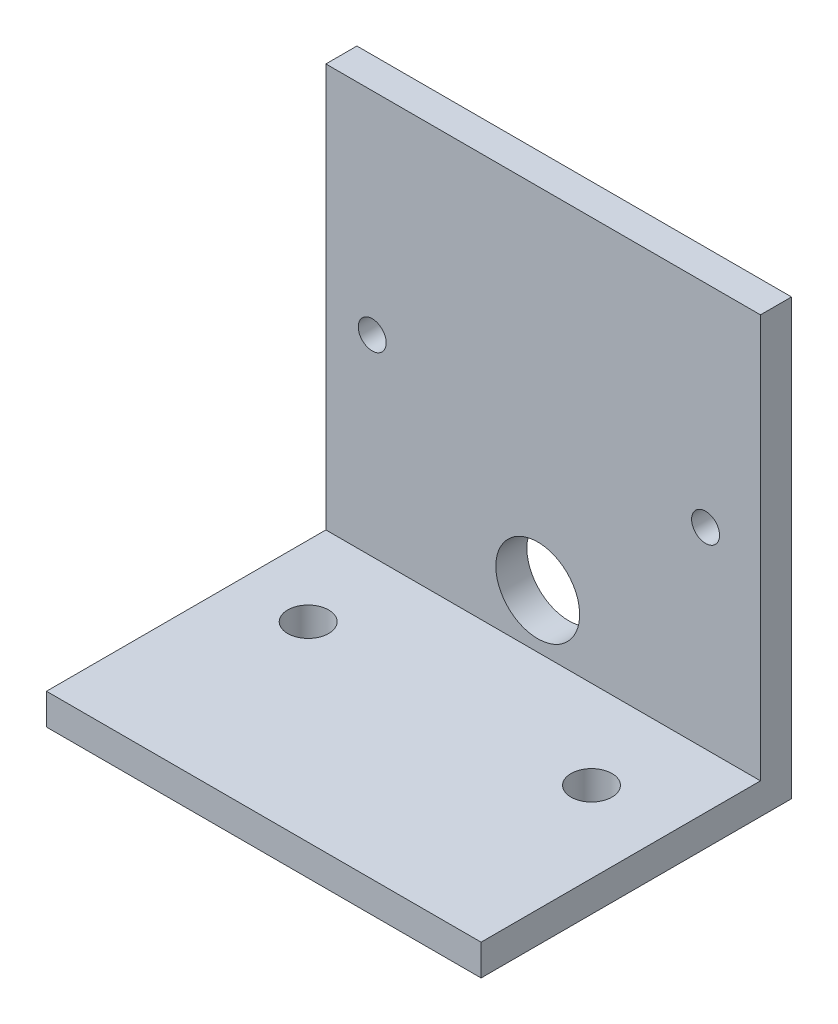
ISO-10303-21;
HEADER;
FILE_DESCRIPTION(('STEP AP214'),'2;1');
FILE_NAME('part.step','',(''),(''),'','','');
FILE_SCHEMA(('AUTOMOTIVE_DESIGN { 1 0 10303 214 1 1 1 1 }'));
ENDSEC;
DATA;
#1=APPLICATION_CONTEXT('core data for automotive mechanical design processes');
#2=APPLICATION_PROTOCOL_DEFINITION('international standard','automotive_design',2000,#1);
#3=PRODUCT_CONTEXT('',#1,'mechanical');
#4=PRODUCT('Part','Part','',(#3));
#5=PRODUCT_RELATED_PRODUCT_CATEGORY('part','',(#4));
#6=PRODUCT_DEFINITION_FORMATION('','',#4);
#7=PRODUCT_DEFINITION_CONTEXT('part definition',#1,'design');
#8=PRODUCT_DEFINITION('design','',#6,#7);
#9=PRODUCT_DEFINITION_SHAPE('','',#8);
#10=(LENGTH_UNIT() NAMED_UNIT(*) SI_UNIT(.MILLI.,.METRE.));
#11=(NAMED_UNIT(*) PLANE_ANGLE_UNIT() SI_UNIT($,.RADIAN.));
#12=(NAMED_UNIT(*) SI_UNIT($,.STERADIAN.) SOLID_ANGLE_UNIT());
#13=UNCERTAINTY_MEASURE_WITH_UNIT(LENGTH_MEASURE(1.E-05),#10,'distance_accuracy_value','');
#14=(GEOMETRIC_REPRESENTATION_CONTEXT(3) GLOBAL_UNCERTAINTY_ASSIGNED_CONTEXT((#13)) GLOBAL_UNIT_ASSIGNED_CONTEXT((#10,
#11,#12)) REPRESENTATION_CONTEXT('',''));
#15=CARTESIAN_POINT('',(0.,0.,0.));
#16=DIRECTION('',(0.,0.,1.));
#17=DIRECTION('',(1.,0.,0.));
#18=AXIS2_PLACEMENT_3D('',#15,#16,#17);
#19=CARTESIAN_POINT('',(35.,-35.,50.));
#20=DIRECTION('',(-1.,0.,0.));
#21=DIRECTION('',(0.,0.,1.));
#22=AXIS2_PLACEMENT_3D('',#19,#20,#21);
#23=PLANE('',#22);
#24=DIRECTION('',(0.,1.,0.));
#25=VECTOR('',#24,1.);
#26=CARTESIAN_POINT('',(35.,-30.,5.));
#27=LINE('',#26,#25);
#28=CARTESIAN_POINT('',(35.,-30.,5.));
#29=VERTEX_POINT('',#28);
#30=CARTESIAN_POINT('',(35.,35.,5.));
#31=VERTEX_POINT('',#30);
#32=EDGE_CURVE('E137',#29,#31,#27,.T.);
#33=ORIENTED_EDGE('',*,*,#32,.F.);
#34=DIRECTION('',(0.,0.,-1.));
#35=VECTOR('',#34,1.);
#36=CARTESIAN_POINT('',(35.,-30.,128.137615707359));
#37=LINE('',#36,#35);
#38=CARTESIAN_POINT('',(35.,-30.,50.));
#39=VERTEX_POINT('',#38);
#40=EDGE_CURVE('E134',#39,#29,#37,.T.);
#41=ORIENTED_EDGE('',*,*,#40,.F.);
#42=DIRECTION('',(0.,1.,0.));
#43=VECTOR('',#42,1.);
#44=CARTESIAN_POINT('',(35.,-35.,50.));
#45=LINE('',#44,#43);
#46=CARTESIAN_POINT('',(35.,-35.,50.));
#47=VERTEX_POINT('',#46);
#48=EDGE_CURVE('E86',#47,#39,#45,.T.);
#49=ORIENTED_EDGE('',*,*,#48,.F.);
#50=DIRECTION('',(0.,0.,-1.));
#51=VECTOR('',#50,1.);
#52=CARTESIAN_POINT('',(35.,-35.,50.));
#53=LINE('',#52,#51);
#54=CARTESIAN_POINT('',(35.,-35.,0.));
#55=VERTEX_POINT('',#54);
#56=EDGE_CURVE('E79',#47,#55,#53,.T.);
#57=ORIENTED_EDGE('',*,*,#56,.T.);
#58=DIRECTION('',(0.,1.,0.));
#59=VECTOR('',#58,1.);
#60=CARTESIAN_POINT('',(35.,-35.,0.));
#61=LINE('',#60,#59);
#62=CARTESIAN_POINT('',(35.,35.,0.));
#63=VERTEX_POINT('',#62);
#64=EDGE_CURVE('E93',#55,#63,#61,.T.);
#65=ORIENTED_EDGE('',*,*,#64,.T.);
#66=DIRECTION('',(0.,0.,-1.));
#67=VECTOR('',#66,1.);
#68=CARTESIAN_POINT('',(35.,35.,50.));
#69=LINE('',#68,#67);
#70=EDGE_CURVE('E112',#31,#63,#69,.T.);
#71=ORIENTED_EDGE('',*,*,#70,.F.);
#72=EDGE_LOOP('',(#33,#41,#49,#57,#65,#71));
#73=FACE_BOUND('',#72,.T.);
#74=ADVANCED_FACE('F32',(#73),#23,.F.);
#75=CARTESIAN_POINT('',(-35.,35.,50.));
#76=DIRECTION('',(0.,-1.,0.));
#77=DIRECTION('',(0.,0.,-1.));
#78=AXIS2_PLACEMENT_3D('',#75,#76,#77);
#79=PLANE('',#78);
#80=DIRECTION('',(0.,0.,-1.));
#81=VECTOR('',#80,1.);
#82=CARTESIAN_POINT('',(-35.,35.,50.));
#83=LINE('',#82,#81);
#84=CARTESIAN_POINT('',(-35.,35.,5.));
#85=VERTEX_POINT('',#84);
#86=CARTESIAN_POINT('',(-35.,35.,0.));
#87=VERTEX_POINT('',#86);
#88=EDGE_CURVE('E110',#85,#87,#83,.T.);
#89=ORIENTED_EDGE('',*,*,#88,.F.);
#90=DIRECTION('',(1.,0.,0.));
#91=VECTOR('',#90,1.);
#92=CARTESIAN_POINT('',(-35.,35.,5.));
#93=LINE('',#92,#91);
#94=EDGE_CURVE('E100',#85,#31,#93,.T.);
#95=ORIENTED_EDGE('',*,*,#94,.T.);
#96=ORIENTED_EDGE('',*,*,#70,.T.);
#97=DIRECTION('',(-1.,0.,0.));
#98=VECTOR('',#97,1.);
#99=CARTESIAN_POINT('',(-35.,35.,0.));
#100=LINE('',#99,#98);
#101=EDGE_CURVE('E99',#63,#87,#100,.T.);
#102=ORIENTED_EDGE('',*,*,#101,.T.);
#103=EDGE_LOOP('',(#89,#95,#96,#102));
#104=FACE_BOUND('',#103,.T.);
#105=ADVANCED_FACE('F152',(#104),#79,.F.);
#106=CARTESIAN_POINT('',(-35.,-35.,50.));
#107=DIRECTION('',(1.,0.,0.));
#108=DIRECTION('',(0.,0.,-1.));
#109=AXIS2_PLACEMENT_3D('',#106,#107,#108);
#110=PLANE('',#109);
#111=DIRECTION('',(0.,-1.,0.));
#112=VECTOR('',#111,1.);
#113=CARTESIAN_POINT('',(-35.,-35.,50.));
#114=LINE('',#113,#112);
#115=CARTESIAN_POINT('',(-35.,-30.,50.));
#116=VERTEX_POINT('',#115);
#117=CARTESIAN_POINT('',(-35.,-35.,50.));
#118=VERTEX_POINT('',#117);
#119=EDGE_CURVE('E144',#116,#118,#114,.T.);
#120=ORIENTED_EDGE('',*,*,#119,.F.);
#121=DIRECTION('',(0.,0.,-1.));
#122=VECTOR('',#121,1.);
#123=CARTESIAN_POINT('',(-35.,-30.,50.));
#124=LINE('',#123,#122);
#125=CARTESIAN_POINT('',(-35.,-30.,5.));
#126=VERTEX_POINT('',#125);
#127=EDGE_CURVE('E48',#116,#126,#124,.T.);
#128=ORIENTED_EDGE('',*,*,#127,.T.);
#129=DIRECTION('',(0.,1.,0.));
#130=VECTOR('',#129,1.);
#131=CARTESIAN_POINT('',(-35.,-35.,5.));
#132=LINE('',#131,#130);
#133=EDGE_CURVE('E11',#126,#85,#132,.T.);
#134=ORIENTED_EDGE('',*,*,#133,.T.);
#135=ORIENTED_EDGE('',*,*,#88,.T.);
#136=DIRECTION('',(0.,-1.,0.));
#137=VECTOR('',#136,1.);
#138=CARTESIAN_POINT('',(-35.,-35.,0.));
#139=LINE('',#138,#137);
#140=CARTESIAN_POINT('',(-35.,-35.,0.));
#141=VERTEX_POINT('',#140);
#142=EDGE_CURVE('E87',#87,#141,#139,.T.);
#143=ORIENTED_EDGE('',*,*,#142,.T.);
#144=DIRECTION('',(0.,0.,-1.));
#145=VECTOR('',#144,1.);
#146=CARTESIAN_POINT('',(-35.,-35.,50.));
#147=LINE('',#146,#145);
#148=EDGE_CURVE('E82',#118,#141,#147,.T.);
#149=ORIENTED_EDGE('',*,*,#148,.F.);
#150=EDGE_LOOP('',(#120,#128,#134,#135,#143,#149));
#151=FACE_BOUND('',#150,.T.);
#152=ADVANCED_FACE('F148',(#151),#110,.F.);
#153=CARTESIAN_POINT('',(-35.,-35.,50.));
#154=DIRECTION('',(0.,1.,0.));
#155=DIRECTION('',(0.,0.,1.));
#156=AXIS2_PLACEMENT_3D('',#153,#154,#155);
#157=PLANE('',#156);
#158=CARTESIAN_POINT('',(-23.6202761898952,-35.,19.2318135918441));
#159=DIRECTION('',(0.,1.,0.));
#160=DIRECTION('',(0.,0.,1.));
#161=AXIS2_PLACEMENT_3D('',#158,#159,#160);
#162=CIRCLE('',#161,3.3);
#163=CARTESIAN_POINT('',(-23.6202761898952,-35.,22.5318135918441));
#164=VERTEX_POINT('',#163);
#165=EDGE_CURVE('E270',#164,#164,#162,.T.);
#166=ORIENTED_EDGE('',*,*,#165,.T.);
#167=EDGE_LOOP('',(#166));
#168=FACE_BOUND('',#167,.T.);
#169=CARTESIAN_POINT('',(22.0151740031298,-35.,19.2318135918441));
#170=DIRECTION('',(0.,1.,0.));
#171=DIRECTION('',(0.,0.,1.));
#172=AXIS2_PLACEMENT_3D('',#169,#170,#171);
#173=CIRCLE('',#172,3.3);
#174=CARTESIAN_POINT('',(22.0151740031298,-35.,22.5318135918441));
#175=VERTEX_POINT('',#174);
#176=EDGE_CURVE('E278',#175,#175,#173,.T.);
#177=ORIENTED_EDGE('',*,*,#176,.T.);
#178=EDGE_LOOP('',(#177));
#179=FACE_BOUND('',#178,.T.);
#180=DIRECTION('',(1.,0.,0.));
#181=VECTOR('',#180,1.);
#182=CARTESIAN_POINT('',(-35.,-35.,0.));
#183=LINE('',#182,#181);
#184=EDGE_CURVE('E76',#141,#55,#183,.T.);
#185=ORIENTED_EDGE('',*,*,#184,.T.);
#186=ORIENTED_EDGE('',*,*,#56,.F.);
#187=DIRECTION('',(1.,0.,0.));
#188=VECTOR('',#187,1.);
#189=CARTESIAN_POINT('',(-35.,-35.,50.));
#190=LINE('',#189,#188);
#191=EDGE_CURVE('E57',#118,#47,#190,.T.);
#192=ORIENTED_EDGE('',*,*,#191,.F.);
#193=ORIENTED_EDGE('',*,*,#148,.T.);
#194=EDGE_LOOP('',(#185,#186,#192,#193));
#195=FACE_BOUND('',#194,.T.);
#196=ADVANCED_FACE('F78',(#168,#179,#195),#157,.F.);
#197=CARTESIAN_POINT('',(0.,0.,50.));
#198=DIRECTION('',(0.,0.,-1.));
#199=DIRECTION('',(-1.,0.,0.));
#200=AXIS2_PLACEMENT_3D('',#197,#198,#199);
#201=PLANE('',#200);
#202=ORIENTED_EDGE('',*,*,#48,.T.);
#203=DIRECTION('',(-1.,0.,0.));
#204=VECTOR('',#203,1.);
#205=CARTESIAN_POINT('',(0.,-30.,50.));
#206=LINE('',#205,#204);
#207=EDGE_CURVE('E40',#39,#116,#206,.T.);
#208=ORIENTED_EDGE('',*,*,#207,.T.);
#209=ORIENTED_EDGE('',*,*,#119,.T.);
#210=ORIENTED_EDGE('',*,*,#191,.T.);
#211=EDGE_LOOP('',(#202,#208,#209,#210));
#212=FACE_BOUND('',#211,.T.);
#213=ADVANCED_FACE('F146',(#212),#201,.F.);
#214=CARTESIAN_POINT('',(0.,0.,0.));
#215=DIRECTION('',(0.,0.,-1.));
#216=DIRECTION('',(-1.,0.,0.));
#217=AXIS2_PLACEMENT_3D('',#214,#215,#216);
#218=PLANE('',#217);
#219=CARTESIAN_POINT('',(-0.875458957650732,-21.3663952674459,0.));
#220=DIRECTION('',(0.,0.,-1.));
#221=DIRECTION('',(-1.,0.,0.));
#222=AXIS2_PLACEMENT_3D('',#219,#220,#221);
#223=CIRCLE('',#222,6.74999999999999);
#224=CARTESIAN_POINT('',(-7.62545895765073,-21.3663952674459,0.));
#225=VERTEX_POINT('',#224);
#226=EDGE_CURVE('E128',#225,#225,#223,.T.);
#227=ORIENTED_EDGE('',*,*,#226,.F.);
#228=EDGE_LOOP('',(#227));
#229=FACE_BOUND('',#228,.T.);
#230=CARTESIAN_POINT('',(26.1575779048771,0.946358973345163,0.));
#231=DIRECTION('',(0.,0.,-1.));
#232=DIRECTION('',(-1.,0.,0.));
#233=AXIS2_PLACEMENT_3D('',#230,#231,#232);
#234=CIRCLE('',#233,2.25);
#235=CARTESIAN_POINT('',(23.907577904877,0.946358973345163,0.));
#236=VERTEX_POINT('',#235);
#237=EDGE_CURVE('E117',#236,#236,#234,.T.);
#238=ORIENTED_EDGE('',*,*,#237,.F.);
#239=EDGE_LOOP('',(#238));
#240=FACE_BOUND('',#239,.T.);
#241=CARTESIAN_POINT('',(-27.5331176466196,0.946358973345163,0.));
#242=DIRECTION('',(0.,0.,-1.));
#243=DIRECTION('',(-1.,0.,0.));
#244=AXIS2_PLACEMENT_3D('',#241,#242,#243);
#245=CIRCLE('',#244,2.25);
#246=CARTESIAN_POINT('',(-29.7831176466196,0.946358973345163,0.));
#247=VERTEX_POINT('',#246);
#248=EDGE_CURVE('E116',#247,#247,#245,.T.);
#249=ORIENTED_EDGE('',*,*,#248,.F.);
#250=EDGE_LOOP('',(#249));
#251=FACE_BOUND('',#250,.T.);
#252=ORIENTED_EDGE('',*,*,#64,.F.);
#253=ORIENTED_EDGE('',*,*,#184,.F.);
#254=ORIENTED_EDGE('',*,*,#142,.F.);
#255=ORIENTED_EDGE('',*,*,#101,.F.);
#256=EDGE_LOOP('',(#252,#253,#254,#255));
#257=FACE_BOUND('',#256,.T.);
#258=ADVANCED_FACE('F97',(#229,#240,#251,#257),#218,.T.);
#259=CARTESIAN_POINT('',(-182.,-30.,5.));
#260=DIRECTION('',(0.,0.,-1.));
#261=DIRECTION('',(-1.,0.,0.));
#262=AXIS2_PLACEMENT_3D('',#259,#260,#261);
#263=PLANE('',#262);
#264=CARTESIAN_POINT('',(-0.875458957650732,-21.3663952674459,5.));
#265=DIRECTION('',(0.,0.,-1.));
#266=DIRECTION('',(-1.,0.,0.));
#267=AXIS2_PLACEMENT_3D('',#264,#265,#266);
#268=CIRCLE('',#267,6.74999999999999);
#269=CARTESIAN_POINT('',(-7.62545895765072,-21.3663952674459,5.));
#270=VERTEX_POINT('',#269);
#271=EDGE_CURVE('E35',#270,#270,#268,.T.);
#272=ORIENTED_EDGE('',*,*,#271,.T.);
#273=EDGE_LOOP('',(#272));
#274=FACE_BOUND('',#273,.T.);
#275=CARTESIAN_POINT('',(26.1575779048771,0.946358973345163,5.));
#276=DIRECTION('',(0.,0.,-1.));
#277=DIRECTION('',(-1.,0.,0.));
#278=AXIS2_PLACEMENT_3D('',#275,#276,#277);
#279=CIRCLE('',#278,2.25);
#280=CARTESIAN_POINT('',(23.9075779048771,0.946358973345163,5.));
#281=VERTEX_POINT('',#280);
#282=EDGE_CURVE('E114',#281,#281,#279,.T.);
#283=ORIENTED_EDGE('',*,*,#282,.T.);
#284=EDGE_LOOP('',(#283));
#285=FACE_BOUND('',#284,.T.);
#286=CARTESIAN_POINT('',(-27.5331176466196,0.946358973345163,5.));
#287=DIRECTION('',(0.,0.,-1.));
#288=DIRECTION('',(-1.,0.,0.));
#289=AXIS2_PLACEMENT_3D('',#286,#287,#288);
#290=CIRCLE('',#289,2.25);
#291=CARTESIAN_POINT('',(-29.7831176466196,0.946358973345163,5.));
#292=VERTEX_POINT('',#291);
#293=EDGE_CURVE('E121',#292,#292,#290,.T.);
#294=ORIENTED_EDGE('',*,*,#293,.T.);
#295=EDGE_LOOP('',(#294));
#296=FACE_BOUND('',#295,.T.);
#297=ORIENTED_EDGE('',*,*,#133,.F.);
#298=DIRECTION('',(1.,0.,0.));
#299=VECTOR('',#298,1.);
#300=CARTESIAN_POINT('',(-182.,-30.,5.));
#301=LINE('',#300,#299);
#302=EDGE_CURVE('E140',#126,#29,#301,.T.);
#303=ORIENTED_EDGE('',*,*,#302,.T.);
#304=ORIENTED_EDGE('',*,*,#32,.T.);
#305=ORIENTED_EDGE('',*,*,#94,.F.);
#306=EDGE_LOOP('',(#297,#303,#304,#305));
#307=FACE_BOUND('',#306,.T.);
#308=ADVANCED_FACE('F163',(#274,#285,#296,#307),#263,.F.);
#309=CARTESIAN_POINT('',(-182.,-30.,128.137615707359));
#310=DIRECTION('',(0.,-1.,0.));
#311=DIRECTION('',(0.,0.,-1.));
#312=AXIS2_PLACEMENT_3D('',#309,#310,#311);
#313=PLANE('',#312);
#314=CARTESIAN_POINT('',(-23.6202761898952,-30.,19.2318135918441));
#315=DIRECTION('',(0.,1.,0.));
#316=DIRECTION('',(0.,0.,1.));
#317=AXIS2_PLACEMENT_3D('',#314,#315,#316);
#318=CIRCLE('',#317,3.3);
#319=CARTESIAN_POINT('',(-23.6202761898952,-30.,22.5318135918441));
#320=VERTEX_POINT('',#319);
#321=EDGE_CURVE('E272',#320,#320,#318,.T.);
#322=ORIENTED_EDGE('',*,*,#321,.F.);
#323=EDGE_LOOP('',(#322));
#324=FACE_BOUND('',#323,.T.);
#325=CARTESIAN_POINT('',(22.0151740031298,-30.,19.2318135918441));
#326=DIRECTION('',(0.,1.,0.));
#327=DIRECTION('',(0.,0.,1.));
#328=AXIS2_PLACEMENT_3D('',#325,#326,#327);
#329=CIRCLE('',#328,3.3);
#330=CARTESIAN_POINT('',(22.0151740031298,-30.,22.5318135918441));
#331=VERTEX_POINT('',#330);
#332=EDGE_CURVE('E274',#331,#331,#329,.T.);
#333=ORIENTED_EDGE('',*,*,#332,.F.);
#334=EDGE_LOOP('',(#333));
#335=FACE_BOUND('',#334,.T.);
#336=ORIENTED_EDGE('',*,*,#207,.F.);
#337=ORIENTED_EDGE('',*,*,#40,.T.);
#338=ORIENTED_EDGE('',*,*,#302,.F.);
#339=ORIENTED_EDGE('',*,*,#127,.F.);
#340=EDGE_LOOP('',(#336,#337,#338,#339));
#341=FACE_BOUND('',#340,.T.);
#342=ADVANCED_FACE('F164',(#324,#335,#341),#313,.F.);
#343=CARTESIAN_POINT('',(-27.5331176466196,0.946358973345163,0.));
#344=DIRECTION('',(0.,0.,-1.));
#345=DIRECTION('',(-1.,0.,0.));
#346=AXIS2_PLACEMENT_3D('',#343,#344,#345);
#347=CYLINDRICAL_SURFACE('',#346,2.25);
#348=ORIENTED_EDGE('',*,*,#248,.T.);
#349=EDGE_LOOP('',(#348));
#350=FACE_BOUND('',#349,.T.);
#351=ORIENTED_EDGE('',*,*,#293,.F.);
#352=EDGE_LOOP('',(#351));
#353=FACE_BOUND('',#352,.T.);
#354=ADVANCED_FACE('F166',(#350,#353),#347,.F.);
#355=CARTESIAN_POINT('',(26.1575779048771,0.946358973345163,0.));
#356=DIRECTION('',(0.,0.,-1.));
#357=DIRECTION('',(-1.,0.,0.));
#358=AXIS2_PLACEMENT_3D('',#355,#356,#357);
#359=CYLINDRICAL_SURFACE('',#358,2.25);
#360=ORIENTED_EDGE('',*,*,#237,.T.);
#361=EDGE_LOOP('',(#360));
#362=FACE_BOUND('',#361,.T.);
#363=ORIENTED_EDGE('',*,*,#282,.F.);
#364=EDGE_LOOP('',(#363));
#365=FACE_BOUND('',#364,.T.);
#366=ADVANCED_FACE('F173',(#362,#365),#359,.F.);
#367=CARTESIAN_POINT('',(-0.875458957650732,-21.3663952674459,0.));
#368=DIRECTION('',(0.,0.,-1.));
#369=DIRECTION('',(-1.,0.,0.));
#370=AXIS2_PLACEMENT_3D('',#367,#368,#369);
#371=CYLINDRICAL_SURFACE('',#370,6.74999999999999);
#372=ORIENTED_EDGE('',*,*,#226,.T.);
#373=EDGE_LOOP('',(#372));
#374=FACE_BOUND('',#373,.T.);
#375=ORIENTED_EDGE('',*,*,#271,.F.);
#376=EDGE_LOOP('',(#375));
#377=FACE_BOUND('',#376,.T.);
#378=ADVANCED_FACE('F217',(#374,#377),#371,.F.);
#379=CARTESIAN_POINT('',(22.0151740031298,-30.,19.2318135918441));
#380=DIRECTION('',(0.,1.,0.));
#381=DIRECTION('',(0.,0.,1.));
#382=AXIS2_PLACEMENT_3D('',#379,#380,#381);
#383=CYLINDRICAL_SURFACE('',#382,3.3);
#384=ORIENTED_EDGE('',*,*,#176,.F.);
#385=EDGE_LOOP('',(#384));
#386=FACE_BOUND('',#385,.T.);
#387=ORIENTED_EDGE('',*,*,#332,.T.);
#388=EDGE_LOOP('',(#387));
#389=FACE_BOUND('',#388,.T.);
#390=ADVANCED_FACE('F221',(#386,#389),#383,.F.);
#391=CARTESIAN_POINT('',(-23.6202761898952,-30.,19.2318135918441));
#392=DIRECTION('',(0.,1.,0.));
#393=DIRECTION('',(0.,0.,1.));
#394=AXIS2_PLACEMENT_3D('',#391,#392,#393);
#395=CYLINDRICAL_SURFACE('',#394,3.3);
#396=ORIENTED_EDGE('',*,*,#165,.F.);
#397=EDGE_LOOP('',(#396));
#398=FACE_BOUND('',#397,.T.);
#399=ORIENTED_EDGE('',*,*,#321,.T.);
#400=EDGE_LOOP('',(#399));
#401=FACE_BOUND('',#400,.T.);
#402=ADVANCED_FACE('F243',(#398,#401),#395,.F.);
#403=CLOSED_SHELL('',(#74,#105,#152,#196,#213,#258,#308,#342,#354,#366,#378,#390,#402));
#404=MANIFOLD_SOLID_BREP('B2',#403);
#405=ADVANCED_BREP_SHAPE_REPRESENTATION('',(#18,#404),#14);
#406=SHAPE_DEFINITION_REPRESENTATION(#9,#405);
ENDSEC;
END-ISO-10303-21;
